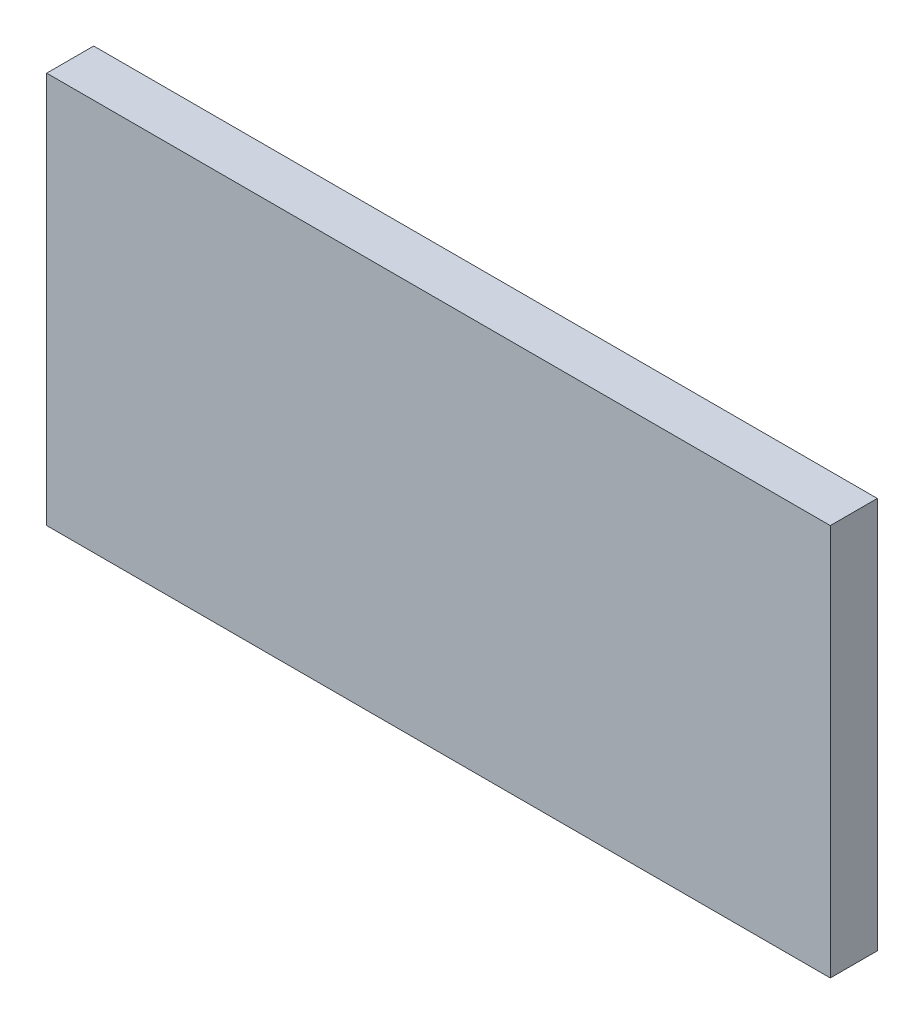
ISO-10303-21;
HEADER;
FILE_DESCRIPTION(('STEP AP214'),'2;1');
FILE_NAME('part.step','',(''),(''),'','','');
FILE_SCHEMA(('AUTOMOTIVE_DESIGN { 1 0 10303 214 1 1 1 1 }'));
ENDSEC;
DATA;
#1=APPLICATION_CONTEXT('core data for automotive mechanical design processes');
#2=APPLICATION_PROTOCOL_DEFINITION('international standard','automotive_design',2000,#1);
#3=PRODUCT_CONTEXT('',#1,'mechanical');
#4=PRODUCT('Part','Part','',(#3));
#5=PRODUCT_RELATED_PRODUCT_CATEGORY('part','',(#4));
#6=PRODUCT_DEFINITION_FORMATION('','',#4);
#7=PRODUCT_DEFINITION_CONTEXT('part definition',#1,'design');
#8=PRODUCT_DEFINITION('design','',#6,#7);
#9=PRODUCT_DEFINITION_SHAPE('','',#8);
#10=(LENGTH_UNIT() NAMED_UNIT(*) SI_UNIT(.MILLI.,.METRE.));
#11=(NAMED_UNIT(*) PLANE_ANGLE_UNIT() SI_UNIT($,.RADIAN.));
#12=(NAMED_UNIT(*) SI_UNIT($,.STERADIAN.) SOLID_ANGLE_UNIT());
#13=UNCERTAINTY_MEASURE_WITH_UNIT(LENGTH_MEASURE(1.E-05),#10,'distance_accuracy_value','');
#14=(GEOMETRIC_REPRESENTATION_CONTEXT(3) GLOBAL_UNCERTAINTY_ASSIGNED_CONTEXT((#13)) GLOBAL_UNIT_ASSIGNED_CONTEXT((#10,
#11,#12)) REPRESENTATION_CONTEXT('',''));
#15=CARTESIAN_POINT('',(0.,0.,0.));
#16=DIRECTION('',(0.,0.,1.));
#17=DIRECTION('',(1.,0.,0.));
#18=AXIS2_PLACEMENT_3D('',#15,#16,#17);
#19=CARTESIAN_POINT('',(0.,0.,18.));
#20=DIRECTION('',(1.,0.,0.));
#21=DIRECTION('',(0.,1.,0.));
#22=AXIS2_PLACEMENT_3D('',#19,#20,#21);
#23=PLANE('',#22);
#24=DIRECTION('',(0.,-1.,0.));
#25=VECTOR('',#24,1.);
#26=CARTESIAN_POINT('',(0.,0.,0.));
#27=LINE('',#26,#25);
#28=CARTESIAN_POINT('',(0.,150.,0.));
#29=VERTEX_POINT('',#28);
#30=CARTESIAN_POINT('',(0.,0.,0.));
#31=VERTEX_POINT('',#30);
#32=EDGE_CURVE('E97',#29,#31,#27,.T.);
#33=ORIENTED_EDGE('',*,*,#32,.T.);
#34=DIRECTION('',(0.,0.,-1.));
#35=VECTOR('',#34,1.);
#36=CARTESIAN_POINT('',(0.,0.,18.));
#37=LINE('',#36,#35);
#38=CARTESIAN_POINT('',(0.,0.,18.));
#39=VERTEX_POINT('',#38);
#40=EDGE_CURVE('E11',#39,#31,#37,.T.);
#41=ORIENTED_EDGE('',*,*,#40,.F.);
#42=DIRECTION('',(0.,-1.,0.));
#43=VECTOR('',#42,1.);
#44=CARTESIAN_POINT('',(0.,0.,18.));
#45=LINE('',#44,#43);
#46=CARTESIAN_POINT('',(0.,150.,18.));
#47=VERTEX_POINT('',#46);
#48=EDGE_CURVE('E85',#47,#39,#45,.T.);
#49=ORIENTED_EDGE('',*,*,#48,.F.);
#50=DIRECTION('',(0.,0.,-1.));
#51=VECTOR('',#50,1.);
#52=CARTESIAN_POINT('',(0.,150.,18.));
#53=LINE('',#52,#51);
#54=EDGE_CURVE('E93',#47,#29,#53,.T.);
#55=ORIENTED_EDGE('',*,*,#54,.T.);
#56=EDGE_LOOP('',(#33,#41,#49,#55));
#57=FACE_BOUND('',#56,.T.);
#58=ADVANCED_FACE('F34',(#57),#23,.F.);
#59=CARTESIAN_POINT('',(0.,0.,18.));
#60=DIRECTION('',(0.,1.,0.));
#61=DIRECTION('',(0.,0.,1.));
#62=AXIS2_PLACEMENT_3D('',#59,#60,#61);
#63=PLANE('',#62);
#64=DIRECTION('',(1.,0.,0.));
#65=VECTOR('',#64,1.);
#66=CARTESIAN_POINT('',(0.,0.,0.));
#67=LINE('',#66,#65);
#68=CARTESIAN_POINT('',(300.,0.,0.));
#69=VERTEX_POINT('',#68);
#70=EDGE_CURVE('E89',#31,#69,#67,.T.);
#71=ORIENTED_EDGE('',*,*,#70,.T.);
#72=DIRECTION('',(0.,0.,-1.));
#73=VECTOR('',#72,1.);
#74=CARTESIAN_POINT('',(300.,0.,18.));
#75=LINE('',#74,#73);
#76=CARTESIAN_POINT('',(300.,0.,18.));
#77=VERTEX_POINT('',#76);
#78=EDGE_CURVE('E42',#77,#69,#75,.T.);
#79=ORIENTED_EDGE('',*,*,#78,.F.);
#80=DIRECTION('',(1.,0.,0.));
#81=VECTOR('',#80,1.);
#82=CARTESIAN_POINT('',(0.,0.,18.));
#83=LINE('',#82,#81);
#84=EDGE_CURVE('E80',#39,#77,#83,.T.);
#85=ORIENTED_EDGE('',*,*,#84,.F.);
#86=ORIENTED_EDGE('',*,*,#40,.T.);
#87=EDGE_LOOP('',(#71,#79,#85,#86));
#88=FACE_BOUND('',#87,.T.);
#89=ADVANCED_FACE('F88',(#88),#63,.F.);
#90=CARTESIAN_POINT('',(300.,0.,18.));
#91=DIRECTION('',(-1.,0.,0.));
#92=DIRECTION('',(0.,0.,1.));
#93=AXIS2_PLACEMENT_3D('',#90,#91,#92);
#94=PLANE('',#93);
#95=DIRECTION('',(0.,1.,0.));
#96=VECTOR('',#95,1.);
#97=CARTESIAN_POINT('',(300.,0.,0.));
#98=LINE('',#97,#96);
#99=CARTESIAN_POINT('',(300.,150.,0.));
#100=VERTEX_POINT('',#99);
#101=EDGE_CURVE('E67',#69,#100,#98,.T.);
#102=ORIENTED_EDGE('',*,*,#101,.T.);
#103=DIRECTION('',(0.,0.,-1.));
#104=VECTOR('',#103,1.);
#105=CARTESIAN_POINT('',(300.,150.,18.));
#106=LINE('',#105,#104);
#107=CARTESIAN_POINT('',(300.,150.,18.));
#108=VERTEX_POINT('',#107);
#109=EDGE_CURVE('E90',#108,#100,#106,.T.);
#110=ORIENTED_EDGE('',*,*,#109,.F.);
#111=DIRECTION('',(0.,1.,0.));
#112=VECTOR('',#111,1.);
#113=CARTESIAN_POINT('',(300.,0.,18.));
#114=LINE('',#113,#112);
#115=EDGE_CURVE('E83',#77,#108,#114,.T.);
#116=ORIENTED_EDGE('',*,*,#115,.F.);
#117=ORIENTED_EDGE('',*,*,#78,.T.);
#118=EDGE_LOOP('',(#102,#110,#116,#117));
#119=FACE_BOUND('',#118,.T.);
#120=ADVANCED_FACE('F91',(#119),#94,.F.);
#121=CARTESIAN_POINT('',(0.,150.,18.));
#122=DIRECTION('',(0.,-1.,0.));
#123=DIRECTION('',(0.,0.,-1.));
#124=AXIS2_PLACEMENT_3D('',#121,#122,#123);
#125=PLANE('',#124);
#126=DIRECTION('',(-1.,0.,0.));
#127=VECTOR('',#126,1.);
#128=CARTESIAN_POINT('',(0.,150.,0.));
#129=LINE('',#128,#127);
#130=EDGE_CURVE('E73',#100,#29,#129,.T.);
#131=ORIENTED_EDGE('',*,*,#130,.T.);
#132=ORIENTED_EDGE('',*,*,#54,.F.);
#133=DIRECTION('',(-1.,0.,0.));
#134=VECTOR('',#133,1.);
#135=CARTESIAN_POINT('',(0.,150.,18.));
#136=LINE('',#135,#134);
#137=EDGE_CURVE('E50',#108,#47,#136,.T.);
#138=ORIENTED_EDGE('',*,*,#137,.F.);
#139=ORIENTED_EDGE('',*,*,#109,.T.);
#140=EDGE_LOOP('',(#131,#132,#138,#139));
#141=FACE_BOUND('',#140,.T.);
#142=ADVANCED_FACE('F104',(#141),#125,.F.);
#143=CARTESIAN_POINT('',(0.,0.,18.));
#144=DIRECTION('',(0.,0.,-1.));
#145=DIRECTION('',(-1.,0.,0.));
#146=AXIS2_PLACEMENT_3D('',#143,#144,#145);
#147=PLANE('',#146);
#148=ORIENTED_EDGE('',*,*,#48,.T.);
#149=ORIENTED_EDGE('',*,*,#84,.T.);
#150=ORIENTED_EDGE('',*,*,#115,.T.);
#151=ORIENTED_EDGE('',*,*,#137,.T.);
#152=EDGE_LOOP('',(#148,#149,#150,#151));
#153=FACE_BOUND('',#152,.T.);
#154=ADVANCED_FACE('F81',(#153),#147,.F.);
#155=CARTESIAN_POINT('',(0.,0.,0.));
#156=DIRECTION('',(0.,0.,-1.));
#157=DIRECTION('',(-1.,0.,0.));
#158=AXIS2_PLACEMENT_3D('',#155,#156,#157);
#159=PLANE('',#158);
#160=ORIENTED_EDGE('',*,*,#32,.F.);
#161=ORIENTED_EDGE('',*,*,#130,.F.);
#162=ORIENTED_EDGE('',*,*,#101,.F.);
#163=ORIENTED_EDGE('',*,*,#70,.F.);
#164=EDGE_LOOP('',(#160,#161,#162,#163));
#165=FACE_BOUND('',#164,.T.);
#166=ADVANCED_FACE('F107',(#165),#159,.T.);
#167=CLOSED_SHELL('',(#58,#89,#120,#142,#154,#166));
#168=MANIFOLD_SOLID_BREP('B2',#167);
#169=ADVANCED_BREP_SHAPE_REPRESENTATION('',(#18,#168),#14);
#170=SHAPE_DEFINITION_REPRESENTATION(#9,#169);
ENDSEC;
END-ISO-10303-21;
